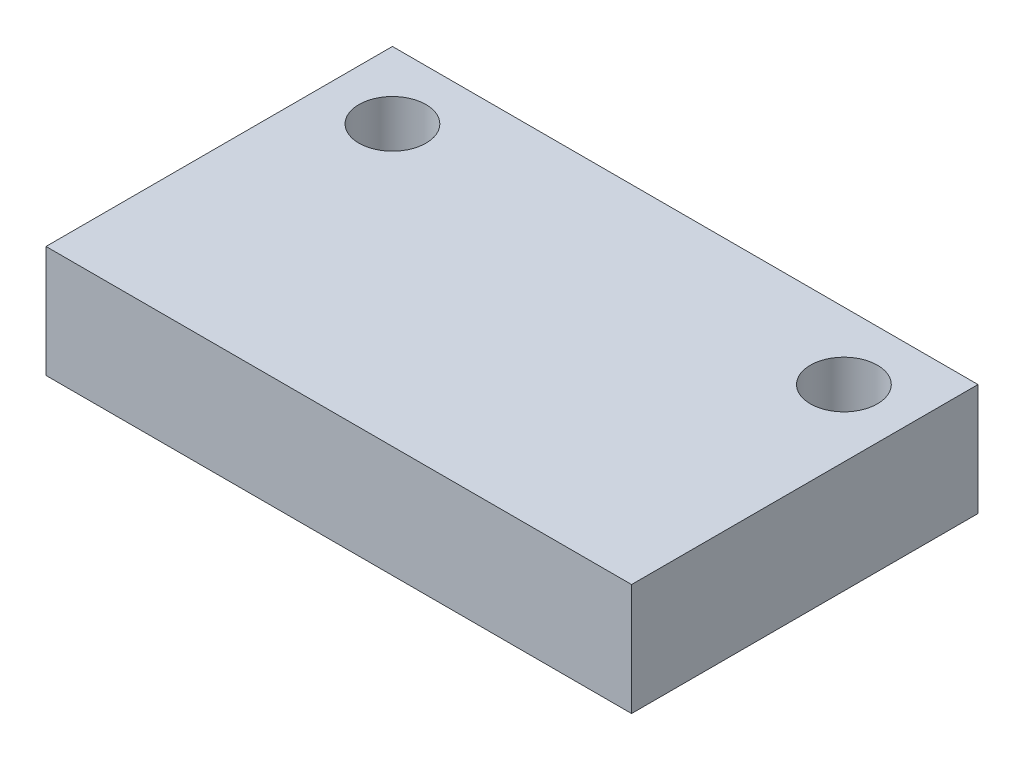
ISO-10303-21;
HEADER;
FILE_DESCRIPTION(('STEP AP214'),'2;1');
FILE_NAME('part.step','',(''),(''),'','','');
FILE_SCHEMA(('AUTOMOTIVE_DESIGN { 1 0 10303 214 1 1 1 1 }'));
ENDSEC;
DATA;
#1=APPLICATION_CONTEXT('core data for automotive mechanical design processes');
#2=APPLICATION_PROTOCOL_DEFINITION('international standard','automotive_design',2000,#1);
#3=PRODUCT_CONTEXT('',#1,'mechanical');
#4=PRODUCT('Part','Part','',(#3));
#5=PRODUCT_RELATED_PRODUCT_CATEGORY('part','',(#4));
#6=PRODUCT_DEFINITION_FORMATION('','',#4);
#7=PRODUCT_DEFINITION_CONTEXT('part definition',#1,'design');
#8=PRODUCT_DEFINITION('design','',#6,#7);
#9=PRODUCT_DEFINITION_SHAPE('','',#8);
#10=(LENGTH_UNIT() NAMED_UNIT(*) SI_UNIT(.MILLI.,.METRE.));
#11=(NAMED_UNIT(*) PLANE_ANGLE_UNIT() SI_UNIT($,.RADIAN.));
#12=(NAMED_UNIT(*) SI_UNIT($,.STERADIAN.) SOLID_ANGLE_UNIT());
#13=UNCERTAINTY_MEASURE_WITH_UNIT(LENGTH_MEASURE(1.E-05),#10,'distance_accuracy_value','');
#14=(GEOMETRIC_REPRESENTATION_CONTEXT(3) GLOBAL_UNCERTAINTY_ASSIGNED_CONTEXT((#13)) GLOBAL_UNIT_ASSIGNED_CONTEXT((#10,
#11,#12)) REPRESENTATION_CONTEXT('',''));
#15=CARTESIAN_POINT('',(0.,0.,0.));
#16=DIRECTION('',(0.,0.,1.));
#17=DIRECTION('',(1.,0.,0.));
#18=AXIS2_PLACEMENT_3D('',#15,#16,#17);
#19=CARTESIAN_POINT('',(13.1,5.,-7.75));
#20=DIRECTION('',(-1.,0.,0.));
#21=DIRECTION('',(0.,0.,1.));
#22=AXIS2_PLACEMENT_3D('',#19,#20,#21);
#23=PLANE('',#22);
#24=DIRECTION('',(0.,0.,-1.));
#25=VECTOR('',#24,1.);
#26=CARTESIAN_POINT('',(13.1,0.,-7.75));
#27=LINE('',#26,#25);
#28=CARTESIAN_POINT('',(13.1,0.,7.75));
#29=VERTEX_POINT('',#28);
#30=CARTESIAN_POINT('',(13.1,0.,-7.75));
#31=VERTEX_POINT('',#30);
#32=EDGE_CURVE('E102',#29,#31,#27,.T.);
#33=ORIENTED_EDGE('',*,*,#32,.T.);
#34=DIRECTION('',(0.,-1.,0.));
#35=VECTOR('',#34,1.);
#36=CARTESIAN_POINT('',(13.1,5.,-7.75));
#37=LINE('',#36,#35);
#38=CARTESIAN_POINT('',(13.1,5.,-7.75));
#39=VERTEX_POINT('',#38);
#40=EDGE_CURVE('E11',#39,#31,#37,.T.);
#41=ORIENTED_EDGE('',*,*,#40,.F.);
#42=DIRECTION('',(0.,0.,-1.));
#43=VECTOR('',#42,1.);
#44=CARTESIAN_POINT('',(13.1,5.,-7.75));
#45=LINE('',#44,#43);
#46=CARTESIAN_POINT('',(13.1,5.,7.75));
#47=VERTEX_POINT('',#46);
#48=EDGE_CURVE('E90',#47,#39,#45,.T.);
#49=ORIENTED_EDGE('',*,*,#48,.F.);
#50=DIRECTION('',(0.,-1.,0.));
#51=VECTOR('',#50,1.);
#52=CARTESIAN_POINT('',(13.1,5.,7.75));
#53=LINE('',#52,#51);
#54=EDGE_CURVE('E98',#47,#29,#53,.T.);
#55=ORIENTED_EDGE('',*,*,#54,.T.);
#56=EDGE_LOOP('',(#33,#41,#49,#55));
#57=FACE_BOUND('',#56,.T.);
#58=ADVANCED_FACE('F39',(#57),#23,.F.);
#59=CARTESIAN_POINT('',(-13.1,5.,-7.75));
#60=DIRECTION('',(0.,0.,1.));
#61=DIRECTION('',(1.,0.,0.));
#62=AXIS2_PLACEMENT_3D('',#59,#60,#61);
#63=PLANE('',#62);
#64=DIRECTION('',(-1.,0.,0.));
#65=VECTOR('',#64,1.);
#66=CARTESIAN_POINT('',(-13.1,0.,-7.75));
#67=LINE('',#66,#65);
#68=CARTESIAN_POINT('',(-13.1,0.,-7.75));
#69=VERTEX_POINT('',#68);
#70=EDGE_CURVE('E94',#31,#69,#67,.T.);
#71=ORIENTED_EDGE('',*,*,#70,.T.);
#72=DIRECTION('',(0.,-1.,0.));
#73=VECTOR('',#72,1.);
#74=CARTESIAN_POINT('',(-13.1,5.,-7.75));
#75=LINE('',#74,#73);
#76=CARTESIAN_POINT('',(-13.1,5.,-7.75));
#77=VERTEX_POINT('',#76);
#78=EDGE_CURVE('E47',#77,#69,#75,.T.);
#79=ORIENTED_EDGE('',*,*,#78,.F.);
#80=DIRECTION('',(-1.,0.,0.));
#81=VECTOR('',#80,1.);
#82=CARTESIAN_POINT('',(-13.1,5.,-7.75));
#83=LINE('',#82,#81);
#84=EDGE_CURVE('E85',#39,#77,#83,.T.);
#85=ORIENTED_EDGE('',*,*,#84,.F.);
#86=ORIENTED_EDGE('',*,*,#40,.T.);
#87=EDGE_LOOP('',(#71,#79,#85,#86));
#88=FACE_BOUND('',#87,.T.);
#89=ADVANCED_FACE('F93',(#88),#63,.F.);
#90=CARTESIAN_POINT('',(-13.1,5.,-7.75));
#91=DIRECTION('',(1.,0.,0.));
#92=DIRECTION('',(0.,0.,-1.));
#93=AXIS2_PLACEMENT_3D('',#90,#91,#92);
#94=PLANE('',#93);
#95=DIRECTION('',(0.,0.,1.));
#96=VECTOR('',#95,1.);
#97=CARTESIAN_POINT('',(-13.1,0.,-7.75));
#98=LINE('',#97,#96);
#99=CARTESIAN_POINT('',(-13.1,0.,7.75));
#100=VERTEX_POINT('',#99);
#101=EDGE_CURVE('E72',#69,#100,#98,.T.);
#102=ORIENTED_EDGE('',*,*,#101,.T.);
#103=DIRECTION('',(0.,-1.,0.));
#104=VECTOR('',#103,1.);
#105=CARTESIAN_POINT('',(-13.1,5.,7.75));
#106=LINE('',#105,#104);
#107=CARTESIAN_POINT('',(-13.1,5.,7.75));
#108=VERTEX_POINT('',#107);
#109=EDGE_CURVE('E95',#108,#100,#106,.T.);
#110=ORIENTED_EDGE('',*,*,#109,.F.);
#111=DIRECTION('',(0.,0.,1.));
#112=VECTOR('',#111,1.);
#113=CARTESIAN_POINT('',(-13.1,5.,-7.75));
#114=LINE('',#113,#112);
#115=EDGE_CURVE('E88',#77,#108,#114,.T.);
#116=ORIENTED_EDGE('',*,*,#115,.F.);
#117=ORIENTED_EDGE('',*,*,#78,.T.);
#118=EDGE_LOOP('',(#102,#110,#116,#117));
#119=FACE_BOUND('',#118,.T.);
#120=ADVANCED_FACE('F96',(#119),#94,.F.);
#121=CARTESIAN_POINT('',(-13.1,5.,7.75));
#122=DIRECTION('',(0.,0.,-1.));
#123=DIRECTION('',(-1.,0.,0.));
#124=AXIS2_PLACEMENT_3D('',#121,#122,#123);
#125=PLANE('',#124);
#126=DIRECTION('',(1.,0.,0.));
#127=VECTOR('',#126,1.);
#128=CARTESIAN_POINT('',(-13.1,0.,7.75));
#129=LINE('',#128,#127);
#130=EDGE_CURVE('E78',#100,#29,#129,.T.);
#131=ORIENTED_EDGE('',*,*,#130,.T.);
#132=ORIENTED_EDGE('',*,*,#54,.F.);
#133=DIRECTION('',(1.,0.,0.));
#134=VECTOR('',#133,1.);
#135=CARTESIAN_POINT('',(-13.1,5.,7.75));
#136=LINE('',#135,#134);
#137=EDGE_CURVE('E55',#108,#47,#136,.T.);
#138=ORIENTED_EDGE('',*,*,#137,.F.);
#139=ORIENTED_EDGE('',*,*,#109,.T.);
#140=EDGE_LOOP('',(#131,#132,#138,#139));
#141=FACE_BOUND('',#140,.T.);
#142=ADVANCED_FACE('F110',(#141),#125,.F.);
#143=CARTESIAN_POINT('',(0.,5.,0.));
#144=DIRECTION('',(0.,1.,0.));
#145=DIRECTION('',(0.,0.,1.));
#146=AXIS2_PLACEMENT_3D('',#143,#144,#145);
#147=PLANE('',#146);
#148=CARTESIAN_POINT('',(-10.1,5.,-4.75));
#149=DIRECTION('',(0.,1.,0.));
#150=DIRECTION('',(0.,0.,1.));
#151=AXIS2_PLACEMENT_3D('',#148,#149,#150);
#152=CIRCLE('',#151,1.5);
#153=CARTESIAN_POINT('',(-10.1,5.,-3.25));
#154=VERTEX_POINT('',#153);
#155=EDGE_CURVE('E122',#154,#154,#152,.T.);
#156=ORIENTED_EDGE('',*,*,#155,.F.);
#157=EDGE_LOOP('',(#156));
#158=FACE_BOUND('',#157,.T.);
#159=CARTESIAN_POINT('',(10.1,5.,-4.75));
#160=DIRECTION('',(0.,1.,0.));
#161=DIRECTION('',(0.,0.,1.));
#162=AXIS2_PLACEMENT_3D('',#159,#160,#161);
#163=CIRCLE('',#162,1.5);
#164=CARTESIAN_POINT('',(10.1,5.,-3.25));
#165=VERTEX_POINT('',#164);
#166=EDGE_CURVE('E119',#165,#165,#163,.T.);
#167=ORIENTED_EDGE('',*,*,#166,.F.);
#168=EDGE_LOOP('',(#167));
#169=FACE_BOUND('',#168,.T.);
#170=ORIENTED_EDGE('',*,*,#48,.T.);
#171=ORIENTED_EDGE('',*,*,#84,.T.);
#172=ORIENTED_EDGE('',*,*,#115,.T.);
#173=ORIENTED_EDGE('',*,*,#137,.T.);
#174=EDGE_LOOP('',(#170,#171,#172,#173));
#175=FACE_BOUND('',#174,.T.);
#176=ADVANCED_FACE('F86',(#158,#169,#175),#147,.T.);
#177=CARTESIAN_POINT('',(0.,0.,0.));
#178=DIRECTION('',(0.,1.,0.));
#179=DIRECTION('',(0.,0.,1.));
#180=AXIS2_PLACEMENT_3D('',#177,#178,#179);
#181=PLANE('',#180);
#182=CARTESIAN_POINT('',(-10.1,0.,-4.75));
#183=DIRECTION('',(0.,1.,0.));
#184=DIRECTION('',(0.,0.,1.));
#185=AXIS2_PLACEMENT_3D('',#182,#183,#184);
#186=CIRCLE('',#185,1.5);
#187=CARTESIAN_POINT('',(-10.1,0.,-3.25));
#188=VERTEX_POINT('',#187);
#189=EDGE_CURVE('E105',#188,#188,#186,.T.);
#190=ORIENTED_EDGE('',*,*,#189,.T.);
#191=EDGE_LOOP('',(#190));
#192=FACE_BOUND('',#191,.T.);
#193=CARTESIAN_POINT('',(10.1,0.,-4.75));
#194=DIRECTION('',(0.,1.,0.));
#195=DIRECTION('',(0.,0.,1.));
#196=AXIS2_PLACEMENT_3D('',#193,#194,#195);
#197=CIRCLE('',#196,1.5);
#198=CARTESIAN_POINT('',(10.1,0.,-3.25));
#199=VERTEX_POINT('',#198);
#200=EDGE_CURVE('E116',#199,#199,#197,.T.);
#201=ORIENTED_EDGE('',*,*,#200,.T.);
#202=EDGE_LOOP('',(#201));
#203=FACE_BOUND('',#202,.T.);
#204=ORIENTED_EDGE('',*,*,#32,.F.);
#205=ORIENTED_EDGE('',*,*,#130,.F.);
#206=ORIENTED_EDGE('',*,*,#101,.F.);
#207=ORIENTED_EDGE('',*,*,#70,.F.);
#208=EDGE_LOOP('',(#204,#205,#206,#207));
#209=FACE_BOUND('',#208,.T.);
#210=ADVANCED_FACE('F113',(#192,#203,#209),#181,.F.);
#211=CARTESIAN_POINT('',(10.1,0.,-4.75));
#212=DIRECTION('',(0.,1.,0.));
#213=DIRECTION('',(0.,0.,1.));
#214=AXIS2_PLACEMENT_3D('',#211,#212,#213);
#215=CYLINDRICAL_SURFACE('',#214,1.5);
#216=ORIENTED_EDGE('',*,*,#200,.F.);
#217=EDGE_LOOP('',(#216));
#218=FACE_BOUND('',#217,.T.);
#219=ORIENTED_EDGE('',*,*,#166,.T.);
#220=EDGE_LOOP('',(#219));
#221=FACE_BOUND('',#220,.T.);
#222=ADVANCED_FACE('F133',(#218,#221),#215,.F.);
#223=CARTESIAN_POINT('',(-10.1,0.,-4.75));
#224=DIRECTION('',(0.,1.,0.));
#225=DIRECTION('',(0.,0.,1.));
#226=AXIS2_PLACEMENT_3D('',#223,#224,#225);
#227=CYLINDRICAL_SURFACE('',#226,1.5);
#228=ORIENTED_EDGE('',*,*,#189,.F.);
#229=EDGE_LOOP('',(#228));
#230=FACE_BOUND('',#229,.T.);
#231=ORIENTED_EDGE('',*,*,#155,.T.);
#232=EDGE_LOOP('',(#231));
#233=FACE_BOUND('',#232,.T.);
#234=ADVANCED_FACE('F130',(#230,#233),#227,.F.);
#235=CLOSED_SHELL('',(#58,#89,#120,#142,#176,#210,#222,#234));
#236=MANIFOLD_SOLID_BREP('B2',#235);
#237=ADVANCED_BREP_SHAPE_REPRESENTATION('',(#18,#236),#14);
#238=SHAPE_DEFINITION_REPRESENTATION(#9,#237);
ENDSEC;
END-ISO-10303-21;
